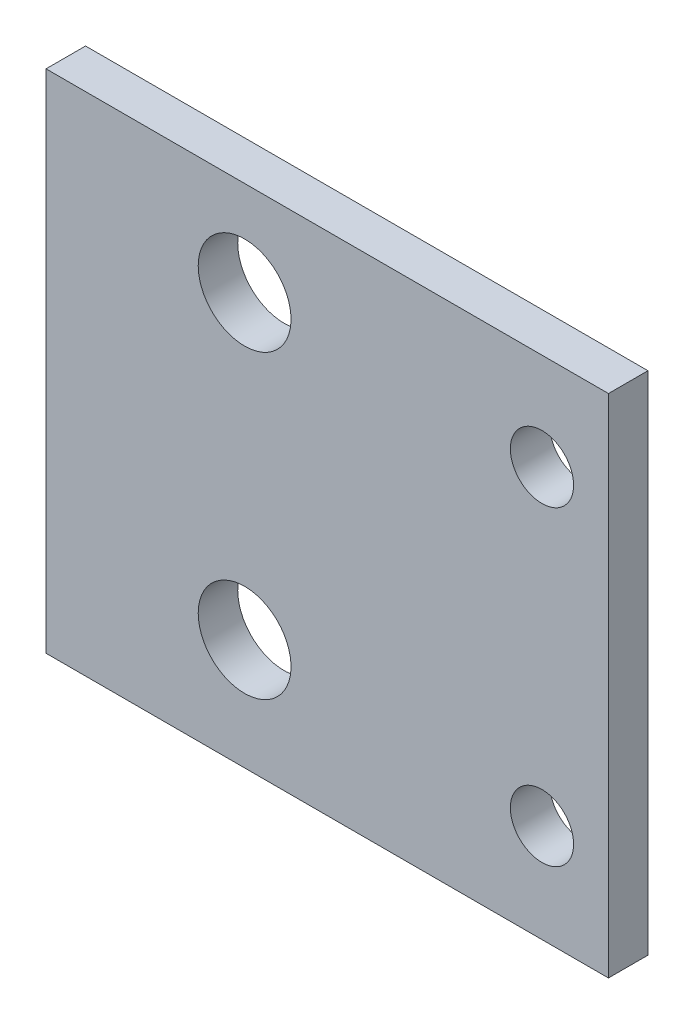
ISO-10303-21;
HEADER;
FILE_DESCRIPTION(('STEP AP214'),'2;1');
FILE_NAME('part.step','',(''),(''),'','','');
FILE_SCHEMA(('AUTOMOTIVE_DESIGN { 1 0 10303 214 1 1 1 1 }'));
ENDSEC;
DATA;
#1=APPLICATION_CONTEXT('core data for automotive mechanical design processes');
#2=APPLICATION_PROTOCOL_DEFINITION('international standard','automotive_design',2000,#1);
#3=PRODUCT_CONTEXT('',#1,'mechanical');
#4=PRODUCT('Part','Part','',(#3));
#5=PRODUCT_RELATED_PRODUCT_CATEGORY('part','',(#4));
#6=PRODUCT_DEFINITION_FORMATION('','',#4);
#7=PRODUCT_DEFINITION_CONTEXT('part definition',#1,'design');
#8=PRODUCT_DEFINITION('design','',#6,#7);
#9=PRODUCT_DEFINITION_SHAPE('','',#8);
#10=(LENGTH_UNIT() NAMED_UNIT(*) SI_UNIT(.MILLI.,.METRE.));
#11=(NAMED_UNIT(*) PLANE_ANGLE_UNIT() SI_UNIT($,.RADIAN.));
#12=(NAMED_UNIT(*) SI_UNIT($,.STERADIAN.) SOLID_ANGLE_UNIT());
#13=UNCERTAINTY_MEASURE_WITH_UNIT(LENGTH_MEASURE(1.E-05),#10,'distance_accuracy_value','');
#14=(GEOMETRIC_REPRESENTATION_CONTEXT(3) GLOBAL_UNCERTAINTY_ASSIGNED_CONTEXT((#13)) GLOBAL_UNIT_ASSIGNED_CONTEXT((#10,
#11,#12)) REPRESENTATION_CONTEXT('',''));
#15=CARTESIAN_POINT('',(0.,0.,0.));
#16=DIRECTION('',(0.,0.,1.));
#17=DIRECTION('',(1.,0.,0.));
#18=AXIS2_PLACEMENT_3D('',#15,#16,#17);
#19=CARTESIAN_POINT('',(20.,-18.,2.81));
#20=DIRECTION('',(-1.,0.,0.));
#21=DIRECTION('',(0.,0.,1.));
#22=AXIS2_PLACEMENT_3D('',#19,#20,#21);
#23=PLANE('',#22);
#24=DIRECTION('',(0.,1.,0.));
#25=VECTOR('',#24,1.);
#26=CARTESIAN_POINT('',(20.,-18.,0.));
#27=LINE('',#26,#25);
#28=CARTESIAN_POINT('',(20.,-18.,0.));
#29=VERTEX_POINT('',#28);
#30=CARTESIAN_POINT('',(20.,18.,0.));
#31=VERTEX_POINT('',#30);
#32=EDGE_CURVE('E96',#29,#31,#27,.T.);
#33=ORIENTED_EDGE('',*,*,#32,.T.);
#34=DIRECTION('',(0.,0.,-1.));
#35=VECTOR('',#34,1.);
#36=CARTESIAN_POINT('',(20.,18.,2.81));
#37=LINE('',#36,#35);
#38=CARTESIAN_POINT('',(20.,18.,2.81));
#39=VERTEX_POINT('',#38);
#40=EDGE_CURVE('E11',#39,#31,#37,.T.);
#41=ORIENTED_EDGE('',*,*,#40,.F.);
#42=DIRECTION('',(0.,1.,0.));
#43=VECTOR('',#42,1.);
#44=CARTESIAN_POINT('',(20.,-18.,2.81));
#45=LINE('',#44,#43);
#46=CARTESIAN_POINT('',(20.,-18.,2.81));
#47=VERTEX_POINT('',#46);
#48=EDGE_CURVE('E84',#47,#39,#45,.T.);
#49=ORIENTED_EDGE('',*,*,#48,.F.);
#50=DIRECTION('',(0.,0.,-1.));
#51=VECTOR('',#50,1.);
#52=CARTESIAN_POINT('',(20.,-18.,2.81));
#53=LINE('',#52,#51);
#54=EDGE_CURVE('E92',#47,#29,#53,.T.);
#55=ORIENTED_EDGE('',*,*,#54,.T.);
#56=EDGE_LOOP('',(#33,#41,#49,#55));
#57=FACE_BOUND('',#56,.T.);
#58=ADVANCED_FACE('F33',(#57),#23,.F.);
#59=CARTESIAN_POINT('',(-20.,18.,2.81));
#60=DIRECTION('',(0.,-1.,0.));
#61=DIRECTION('',(0.,0.,-1.));
#62=AXIS2_PLACEMENT_3D('',#59,#60,#61);
#63=PLANE('',#62);
#64=DIRECTION('',(-1.,0.,0.));
#65=VECTOR('',#64,1.);
#66=CARTESIAN_POINT('',(-20.,18.,0.));
#67=LINE('',#66,#65);
#68=CARTESIAN_POINT('',(-20.,18.,0.));
#69=VERTEX_POINT('',#68);
#70=EDGE_CURVE('E88',#31,#69,#67,.T.);
#71=ORIENTED_EDGE('',*,*,#70,.T.);
#72=DIRECTION('',(0.,0.,-1.));
#73=VECTOR('',#72,1.);
#74=CARTESIAN_POINT('',(-20.,18.,2.81));
#75=LINE('',#74,#73);
#76=CARTESIAN_POINT('',(-20.,18.,2.81));
#77=VERTEX_POINT('',#76);
#78=EDGE_CURVE('E41',#77,#69,#75,.T.);
#79=ORIENTED_EDGE('',*,*,#78,.F.);
#80=DIRECTION('',(-1.,0.,0.));
#81=VECTOR('',#80,1.);
#82=CARTESIAN_POINT('',(-20.,18.,2.81));
#83=LINE('',#82,#81);
#84=EDGE_CURVE('E79',#39,#77,#83,.T.);
#85=ORIENTED_EDGE('',*,*,#84,.F.);
#86=ORIENTED_EDGE('',*,*,#40,.T.);
#87=EDGE_LOOP('',(#71,#79,#85,#86));
#88=FACE_BOUND('',#87,.T.);
#89=ADVANCED_FACE('F87',(#88),#63,.F.);
#90=CARTESIAN_POINT('',(-20.,-18.,2.81));
#91=DIRECTION('',(1.,0.,0.));
#92=DIRECTION('',(0.,0.,-1.));
#93=AXIS2_PLACEMENT_3D('',#90,#91,#92);
#94=PLANE('',#93);
#95=DIRECTION('',(0.,-1.,0.));
#96=VECTOR('',#95,1.);
#97=CARTESIAN_POINT('',(-20.,-18.,0.));
#98=LINE('',#97,#96);
#99=CARTESIAN_POINT('',(-20.,-18.,0.));
#100=VERTEX_POINT('',#99);
#101=EDGE_CURVE('E66',#69,#100,#98,.T.);
#102=ORIENTED_EDGE('',*,*,#101,.T.);
#103=DIRECTION('',(0.,0.,-1.));
#104=VECTOR('',#103,1.);
#105=CARTESIAN_POINT('',(-20.,-18.,2.81));
#106=LINE('',#105,#104);
#107=CARTESIAN_POINT('',(-20.,-18.,2.81));
#108=VERTEX_POINT('',#107);
#109=EDGE_CURVE('E89',#108,#100,#106,.T.);
#110=ORIENTED_EDGE('',*,*,#109,.F.);
#111=DIRECTION('',(0.,-1.,0.));
#112=VECTOR('',#111,1.);
#113=CARTESIAN_POINT('',(-20.,-18.,2.81));
#114=LINE('',#113,#112);
#115=EDGE_CURVE('E82',#77,#108,#114,.T.);
#116=ORIENTED_EDGE('',*,*,#115,.F.);
#117=ORIENTED_EDGE('',*,*,#78,.T.);
#118=EDGE_LOOP('',(#102,#110,#116,#117));
#119=FACE_BOUND('',#118,.T.);
#120=ADVANCED_FACE('F90',(#119),#94,.F.);
#121=CARTESIAN_POINT('',(-20.,-18.,2.81));
#122=DIRECTION('',(0.,1.,0.));
#123=DIRECTION('',(0.,0.,1.));
#124=AXIS2_PLACEMENT_3D('',#121,#122,#123);
#125=PLANE('',#124);
#126=DIRECTION('',(1.,0.,0.));
#127=VECTOR('',#126,1.);
#128=CARTESIAN_POINT('',(-20.,-18.,0.));
#129=LINE('',#128,#127);
#130=EDGE_CURVE('E72',#100,#29,#129,.T.);
#131=ORIENTED_EDGE('',*,*,#130,.T.);
#132=ORIENTED_EDGE('',*,*,#54,.F.);
#133=DIRECTION('',(1.,0.,0.));
#134=VECTOR('',#133,1.);
#135=CARTESIAN_POINT('',(-20.,-18.,2.81));
#136=LINE('',#135,#134);
#137=EDGE_CURVE('E49',#108,#47,#136,.T.);
#138=ORIENTED_EDGE('',*,*,#137,.F.);
#139=ORIENTED_EDGE('',*,*,#109,.T.);
#140=EDGE_LOOP('',(#131,#132,#138,#139));
#141=FACE_BOUND('',#140,.T.);
#142=ADVANCED_FACE('F104',(#141),#125,.F.);
#143=CARTESIAN_POINT('',(0.,0.,2.81));
#144=DIRECTION('',(0.,0.,-1.));
#145=DIRECTION('',(-1.,0.,0.));
#146=AXIS2_PLACEMENT_3D('',#143,#144,#145);
#147=PLANE('',#146);
#148=CARTESIAN_POINT('',(-5.87707464298354,-10.1115763220792,2.81));
#149=DIRECTION('',(0.,0.,-1.));
#150=DIRECTION('',(-1.,0.,0.));
#151=AXIS2_PLACEMENT_3D('',#148,#149,#150);
#152=CIRCLE('',#151,3.3);
#153=CARTESIAN_POINT('',(-9.17707464298354,-10.1115763220792,2.81));
#154=VERTEX_POINT('',#153);
#155=EDGE_CURVE('E127',#154,#154,#152,.T.);
#156=ORIENTED_EDGE('',*,*,#155,.T.);
#157=EDGE_LOOP('',(#156));
#158=FACE_BOUND('',#157,.T.);
#159=CARTESIAN_POINT('',(-5.87707464298354,11.2826505076803,2.81));
#160=DIRECTION('',(0.,0.,-1.));
#161=DIRECTION('',(-1.,0.,0.));
#162=AXIS2_PLACEMENT_3D('',#159,#160,#161);
#163=CIRCLE('',#162,3.3);
#164=CARTESIAN_POINT('',(-9.17707464298354,11.2826505076803,2.81));
#165=VERTEX_POINT('',#164);
#166=EDGE_CURVE('E121',#165,#165,#163,.T.);
#167=ORIENTED_EDGE('',*,*,#166,.T.);
#168=EDGE_LOOP('',(#167));
#169=FACE_BOUND('',#168,.T.);
#170=CARTESIAN_POINT('',(15.273020566729,-10.9999999970785,2.81));
#171=DIRECTION('',(0.,0.,-1.));
#172=DIRECTION('',(-1.,0.,0.));
#173=AXIS2_PLACEMENT_3D('',#170,#171,#172);
#174=CIRCLE('',#173,2.25);
#175=CARTESIAN_POINT('',(13.023020566729,-10.9999999970785,2.81));
#176=VERTEX_POINT('',#175);
#177=EDGE_CURVE('E115',#176,#176,#174,.T.);
#178=ORIENTED_EDGE('',*,*,#177,.T.);
#179=EDGE_LOOP('',(#178));
#180=FACE_BOUND('',#179,.T.);
#181=CARTESIAN_POINT('',(15.273020566729,11.1109074056264,2.81));
#182=DIRECTION('',(0.,0.,-1.));
#183=DIRECTION('',(-1.,0.,0.));
#184=AXIS2_PLACEMENT_3D('',#181,#182,#183);
#185=CIRCLE('',#184,2.25);
#186=CARTESIAN_POINT('',(13.023020566729,11.1109074056264,2.81));
#187=VERTEX_POINT('',#186);
#188=EDGE_CURVE('E99',#187,#187,#185,.T.);
#189=ORIENTED_EDGE('',*,*,#188,.T.);
#190=EDGE_LOOP('',(#189));
#191=FACE_BOUND('',#190,.T.);
#192=ORIENTED_EDGE('',*,*,#48,.T.);
#193=ORIENTED_EDGE('',*,*,#84,.T.);
#194=ORIENTED_EDGE('',*,*,#115,.T.);
#195=ORIENTED_EDGE('',*,*,#137,.T.);
#196=EDGE_LOOP('',(#192,#193,#194,#195));
#197=FACE_BOUND('',#196,.T.);
#198=ADVANCED_FACE('F80',(#158,#169,#180,#191,#197),#147,.F.);
#199=CARTESIAN_POINT('',(0.,0.,0.));
#200=DIRECTION('',(0.,0.,-1.));
#201=DIRECTION('',(-1.,0.,0.));
#202=AXIS2_PLACEMENT_3D('',#199,#200,#201);
#203=PLANE('',#202);
#204=CARTESIAN_POINT('',(-5.87707464298354,-10.1115763220792,0.));
#205=DIRECTION('',(0.,0.,-1.));
#206=DIRECTION('',(-1.,0.,0.));
#207=AXIS2_PLACEMENT_3D('',#204,#205,#206);
#208=CIRCLE('',#207,3.3);
#209=CARTESIAN_POINT('',(-9.17707464298354,-10.1115763220792,0.));
#210=VERTEX_POINT('',#209);
#211=EDGE_CURVE('E130',#210,#210,#208,.T.);
#212=ORIENTED_EDGE('',*,*,#211,.F.);
#213=EDGE_LOOP('',(#212));
#214=FACE_BOUND('',#213,.T.);
#215=CARTESIAN_POINT('',(-5.87707464298354,11.2826505076803,0.));
#216=DIRECTION('',(0.,0.,-1.));
#217=DIRECTION('',(-1.,0.,0.));
#218=AXIS2_PLACEMENT_3D('',#215,#216,#217);
#219=CIRCLE('',#218,3.3);
#220=CARTESIAN_POINT('',(-9.17707464298354,11.2826505076803,0.));
#221=VERTEX_POINT('',#220);
#222=EDGE_CURVE('E124',#221,#221,#219,.T.);
#223=ORIENTED_EDGE('',*,*,#222,.F.);
#224=EDGE_LOOP('',(#223));
#225=FACE_BOUND('',#224,.T.);
#226=CARTESIAN_POINT('',(15.273020566729,-10.9999999970785,0.));
#227=DIRECTION('',(0.,0.,-1.));
#228=DIRECTION('',(-1.,0.,0.));
#229=AXIS2_PLACEMENT_3D('',#226,#227,#228);
#230=CIRCLE('',#229,2.25);
#231=CARTESIAN_POINT('',(13.023020566729,-10.9999999970785,0.));
#232=VERTEX_POINT('',#231);
#233=EDGE_CURVE('E118',#232,#232,#230,.T.);
#234=ORIENTED_EDGE('',*,*,#233,.F.);
#235=EDGE_LOOP('',(#234));
#236=FACE_BOUND('',#235,.T.);
#237=CARTESIAN_POINT('',(15.273020566729,11.1109074056264,0.));
#238=DIRECTION('',(0.,0.,-1.));
#239=DIRECTION('',(-1.,0.,0.));
#240=AXIS2_PLACEMENT_3D('',#237,#238,#239);
#241=CIRCLE('',#240,2.25);
#242=CARTESIAN_POINT('',(13.023020566729,11.1109074056264,0.));
#243=VERTEX_POINT('',#242);
#244=EDGE_CURVE('E112',#243,#243,#241,.T.);
#245=ORIENTED_EDGE('',*,*,#244,.F.);
#246=EDGE_LOOP('',(#245));
#247=FACE_BOUND('',#246,.T.);
#248=ORIENTED_EDGE('',*,*,#32,.F.);
#249=ORIENTED_EDGE('',*,*,#130,.F.);
#250=ORIENTED_EDGE('',*,*,#101,.F.);
#251=ORIENTED_EDGE('',*,*,#70,.F.);
#252=EDGE_LOOP('',(#248,#249,#250,#251));
#253=FACE_BOUND('',#252,.T.);
#254=ADVANCED_FACE('F107',(#214,#225,#236,#247,#253),#203,.T.);
#255=CARTESIAN_POINT('',(15.273020566729,11.1109074056264,0.));
#256=DIRECTION('',(0.,0.,-1.));
#257=DIRECTION('',(-1.,0.,0.));
#258=AXIS2_PLACEMENT_3D('',#255,#256,#257);
#259=CYLINDRICAL_SURFACE('',#258,2.25);
#260=ORIENTED_EDGE('',*,*,#188,.F.);
#261=EDGE_LOOP('',(#260));
#262=FACE_BOUND('',#261,.T.);
#263=ORIENTED_EDGE('',*,*,#244,.T.);
#264=EDGE_LOOP('',(#263));
#265=FACE_BOUND('',#264,.T.);
#266=ADVANCED_FACE('F138',(#262,#265),#259,.F.);
#267=CARTESIAN_POINT('',(15.273020566729,-10.9999999970785,0.));
#268=DIRECTION('',(0.,0.,-1.));
#269=DIRECTION('',(-1.,0.,0.));
#270=AXIS2_PLACEMENT_3D('',#267,#268,#269);
#271=CYLINDRICAL_SURFACE('',#270,2.25);
#272=ORIENTED_EDGE('',*,*,#177,.F.);
#273=EDGE_LOOP('',(#272));
#274=FACE_BOUND('',#273,.T.);
#275=ORIENTED_EDGE('',*,*,#233,.T.);
#276=EDGE_LOOP('',(#275));
#277=FACE_BOUND('',#276,.T.);
#278=ADVANCED_FACE('F147',(#274,#277),#271,.F.);
#279=CARTESIAN_POINT('',(-5.87707464298354,11.2826505076803,0.));
#280=DIRECTION('',(0.,0.,-1.));
#281=DIRECTION('',(-1.,0.,0.));
#282=AXIS2_PLACEMENT_3D('',#279,#280,#281);
#283=CYLINDRICAL_SURFACE('',#282,3.3);
#284=ORIENTED_EDGE('',*,*,#166,.F.);
#285=EDGE_LOOP('',(#284));
#286=FACE_BOUND('',#285,.T.);
#287=ORIENTED_EDGE('',*,*,#222,.T.);
#288=EDGE_LOOP('',(#287));
#289=FACE_BOUND('',#288,.T.);
#290=ADVANCED_FACE('F154',(#286,#289),#283,.F.);
#291=CARTESIAN_POINT('',(-5.87707464298354,-10.1115763220792,0.));
#292=DIRECTION('',(0.,0.,-1.));
#293=DIRECTION('',(-1.,0.,0.));
#294=AXIS2_PLACEMENT_3D('',#291,#292,#293);
#295=CYLINDRICAL_SURFACE('',#294,3.3);
#296=ORIENTED_EDGE('',*,*,#155,.F.);
#297=EDGE_LOOP('',(#296));
#298=FACE_BOUND('',#297,.T.);
#299=ORIENTED_EDGE('',*,*,#211,.T.);
#300=EDGE_LOOP('',(#299));
#301=FACE_BOUND('',#300,.T.);
#302=ADVANCED_FACE('F134',(#298,#301),#295,.F.);
#303=CLOSED_SHELL('',(#58,#89,#120,#142,#198,#254,#266,#278,#290,#302));
#304=MANIFOLD_SOLID_BREP('B2',#303);
#305=ADVANCED_BREP_SHAPE_REPRESENTATION('',(#18,#304),#14);
#306=SHAPE_DEFINITION_REPRESENTATION(#9,#305);
ENDSEC;
END-ISO-10303-21;
